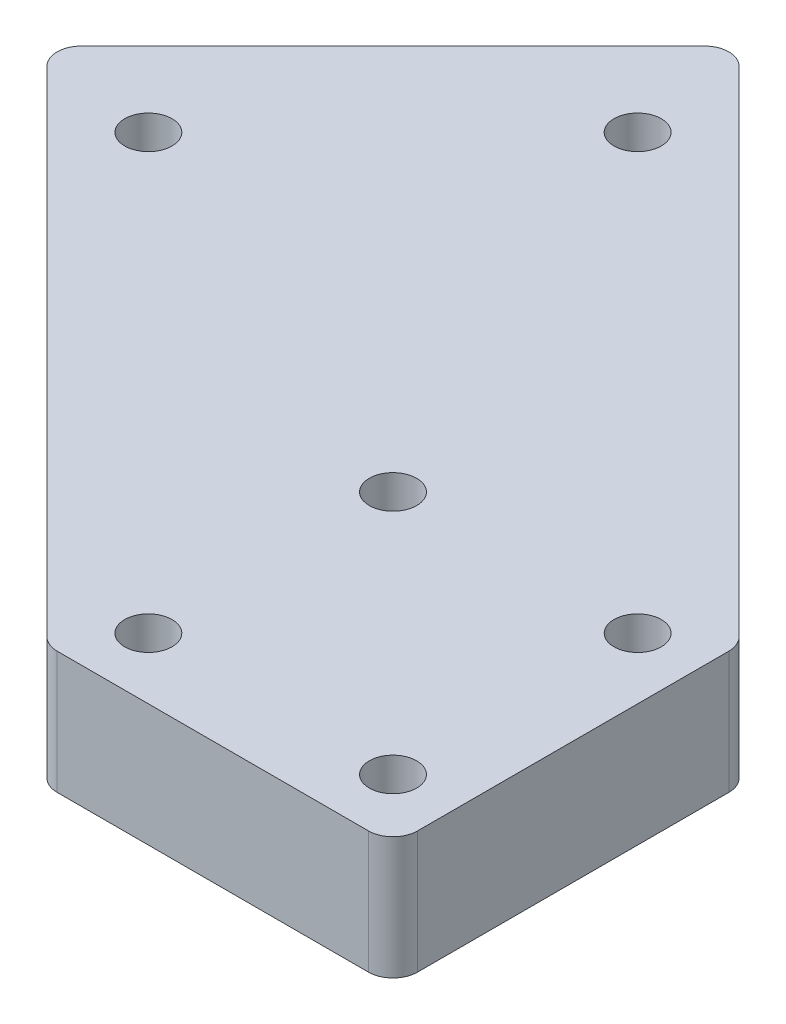
ISO-10303-21;
HEADER;
FILE_DESCRIPTION(('STEP AP214'),'2;1');
FILE_NAME('part.step','',(''),(''),'','','');
FILE_SCHEMA(('AUTOMOTIVE_DESIGN { 1 0 10303 214 1 1 1 1 }'));
ENDSEC;
DATA;
#1=APPLICATION_CONTEXT('core data for automotive mechanical design processes');
#2=APPLICATION_PROTOCOL_DEFINITION('international standard','automotive_design',2000,#1);
#3=PRODUCT_CONTEXT('',#1,'mechanical');
#4=PRODUCT('Part','Part','',(#3));
#5=PRODUCT_RELATED_PRODUCT_CATEGORY('part','',(#4));
#6=PRODUCT_DEFINITION_FORMATION('','',#4);
#7=PRODUCT_DEFINITION_CONTEXT('part definition',#1,'design');
#8=PRODUCT_DEFINITION('design','',#6,#7);
#9=PRODUCT_DEFINITION_SHAPE('','',#8);
#10=(LENGTH_UNIT() NAMED_UNIT(*) SI_UNIT(.MILLI.,.METRE.));
#11=(NAMED_UNIT(*) PLANE_ANGLE_UNIT() SI_UNIT($,.RADIAN.));
#12=(NAMED_UNIT(*) SI_UNIT($,.STERADIAN.) SOLID_ANGLE_UNIT());
#13=UNCERTAINTY_MEASURE_WITH_UNIT(LENGTH_MEASURE(1.E-05),#10,'distance_accuracy_value','');
#14=(GEOMETRIC_REPRESENTATION_CONTEXT(3) GLOBAL_UNCERTAINTY_ASSIGNED_CONTEXT((#13)) GLOBAL_UNIT_ASSIGNED_CONTEXT((#10,
#11,#12)) REPRESENTATION_CONTEXT('',''));
#15=CARTESIAN_POINT('',(0.,0.,0.));
#16=DIRECTION('',(0.,0.,1.));
#17=DIRECTION('',(1.,0.,0.));
#18=AXIS2_PLACEMENT_3D('',#15,#16,#17);
#19=CARTESIAN_POINT('',(-15.4598153963806,12.7,-40.8559797067641));
#20=DIRECTION('',(0.,1.,0.));
#21=DIRECTION('',(0.,0.,1.));
#22=AXIS2_PLACEMENT_3D('',#19,#20,#21);
#23=CYLINDRICAL_SURFACE('',#22,2.45744999999999);
#24=CARTESIAN_POINT('',(-15.4598153963806,12.7,-40.8559797067641));
#25=DIRECTION('',(0.,1.,0.));
#26=DIRECTION('',(0.,0.,1.));
#27=AXIS2_PLACEMENT_3D('',#24,#25,#26);
#28=CIRCLE('',#27,2.45744999999999);
#29=CARTESIAN_POINT('',(-15.4598153963806,12.7,-38.3985297067641));
#30=VERTEX_POINT('',#29);
#31=EDGE_CURVE('E223',#30,#30,#28,.T.);
#32=ORIENTED_EDGE('',*,*,#31,.T.);
#33=EDGE_LOOP('',(#32));
#34=FACE_BOUND('',#33,.T.);
#35=CARTESIAN_POINT('',(-15.4598153963806,6.35,-40.8559797067641));
#36=DIRECTION('',(0.,-1.,0.));
#37=DIRECTION('',(0.,0.,-1.));
#38=AXIS2_PLACEMENT_3D('',#35,#36,#37);
#39=CIRCLE('',#38,2.45744999999999);
#40=CARTESIAN_POINT('',(-15.4598153963806,6.35,-43.3134297067641));
#41=VERTEX_POINT('',#40);
#42=EDGE_CURVE('E155',#41,#41,#39,.F.);
#43=ORIENTED_EDGE('',*,*,#42,.F.);
#44=EDGE_LOOP('',(#43));
#45=FACE_BOUND('',#44,.T.);
#46=ADVANCED_FACE('F43',(#34,#45),#23,.F.);
#47=CARTESIAN_POINT('',(-40.8559797067641,12.7,-15.4598153963805));
#48=DIRECTION('',(0.,1.,0.));
#49=DIRECTION('',(0.,0.,1.));
#50=AXIS2_PLACEMENT_3D('',#47,#48,#49);
#51=CYLINDRICAL_SURFACE('',#50,2.45744999999999);
#52=CARTESIAN_POINT('',(-40.8559797067641,12.7,-15.4598153963805));
#53=DIRECTION('',(0.,1.,0.));
#54=DIRECTION('',(0.,0.,1.));
#55=AXIS2_PLACEMENT_3D('',#52,#53,#54);
#56=CIRCLE('',#55,2.45744999999999);
#57=CARTESIAN_POINT('',(-40.8559797067641,12.7,-13.0023653963806));
#58=VERTEX_POINT('',#57);
#59=EDGE_CURVE('E206',#58,#58,#56,.T.);
#60=ORIENTED_EDGE('',*,*,#59,.T.);
#61=EDGE_LOOP('',(#60));
#62=FACE_BOUND('',#61,.T.);
#63=CARTESIAN_POINT('',(-40.8559797067641,6.35,-15.4598153963805));
#64=DIRECTION('',(0.,-1.,0.));
#65=DIRECTION('',(0.,0.,-1.));
#66=AXIS2_PLACEMENT_3D('',#63,#64,#65);
#67=CIRCLE('',#66,2.45744999999999);
#68=CARTESIAN_POINT('',(-40.8559797067641,6.35,-17.9172653963805));
#69=VERTEX_POINT('',#68);
#70=EDGE_CURVE('E200',#69,#69,#67,.F.);
#71=ORIENTED_EDGE('',*,*,#70,.F.);
#72=EDGE_LOOP('',(#71));
#73=FACE_BOUND('',#72,.T.);
#74=ADVANCED_FACE('F291',(#62,#73),#51,.F.);
#75=CARTESIAN_POINT('',(0.,0.,0.));
#76=DIRECTION('',(0.,1.,0.));
#77=DIRECTION('',(0.,0.,1.));
#78=AXIS2_PLACEMENT_3D('',#75,#76,#77);
#79=PLANE('',#78);
#80=CARTESIAN_POINT('',(-40.8559797067641,0.,-15.4598153963805));
#81=DIRECTION('',(0.,-1.,0.));
#82=DIRECTION('',(0.,0.,-1.));
#83=AXIS2_PLACEMENT_3D('',#80,#81,#82);
#84=CIRCLE('',#83,3.937);
#85=CARTESIAN_POINT('',(-40.8559797067641,0.,-19.3968153963805));
#86=VERTEX_POINT('',#85);
#87=EDGE_CURVE('E208',#86,#86,#84,.T.);
#88=ORIENTED_EDGE('',*,*,#87,.F.);
#89=EDGE_LOOP('',(#88));
#90=FACE_BOUND('',#89,.T.);
#91=CARTESIAN_POINT('',(-15.4598153963806,0.,-40.8559797067641));
#92=DIRECTION('',(0.,-1.,0.));
#93=DIRECTION('',(0.,0.,-1.));
#94=AXIS2_PLACEMENT_3D('',#91,#92,#93);
#95=CIRCLE('',#94,3.937);
#96=CARTESIAN_POINT('',(-15.4598153963806,0.,-44.7929797067641));
#97=VERTEX_POINT('',#96);
#98=EDGE_CURVE('E213',#97,#97,#95,.T.);
#99=ORIENTED_EDGE('',*,*,#98,.F.);
#100=EDGE_LOOP('',(#99));
#101=FACE_BOUND('',#100,.T.);
#102=CARTESIAN_POINT('',(29.5710244842766,0.,29.5710244842766));
#103=DIRECTION('',(0.,-1.,0.));
#104=DIRECTION('',(0.,0.,-1.));
#105=AXIS2_PLACEMENT_3D('',#102,#103,#104);
#106=CIRCLE('',#105,2.45745);
#107=CARTESIAN_POINT('',(29.5710244842766,0.,27.1135744842766));
#108=VERTEX_POINT('',#107);
#109=EDGE_CURVE('E226',#108,#108,#106,.T.);
#110=ORIENTED_EDGE('',*,*,#109,.F.);
#111=EDGE_LOOP('',(#110));
#112=FACE_BOUND('',#111,.T.);
#113=CARTESIAN_POINT('',(29.5710244842766,0.,4.17102448427661));
#114=DIRECTION('',(0.,-1.,0.));
#115=DIRECTION('',(0.,0.,-1.));
#116=AXIS2_PLACEMENT_3D('',#113,#114,#115);
#117=CIRCLE('',#116,2.45745);
#118=CARTESIAN_POINT('',(29.5710244842766,0.,1.71357448427661));
#119=VERTEX_POINT('',#118);
#120=EDGE_CURVE('E238',#119,#119,#117,.T.);
#121=ORIENTED_EDGE('',*,*,#120,.F.);
#122=EDGE_LOOP('',(#121));
#123=FACE_BOUND('',#122,.T.);
#124=CARTESIAN_POINT('',(4.17102448427662,0.,29.5710244842766));
#125=DIRECTION('',(0.,-1.,0.));
#126=DIRECTION('',(0.,0.,-1.));
#127=AXIS2_PLACEMENT_3D('',#124,#125,#126);
#128=CIRCLE('',#127,2.45745);
#129=CARTESIAN_POINT('',(4.17102448427662,0.,27.1135744842766));
#130=VERTEX_POINT('',#129);
#131=EDGE_CURVE('E244',#130,#130,#128,.T.);
#132=ORIENTED_EDGE('',*,*,#131,.F.);
#133=EDGE_LOOP('',(#132));
#134=FACE_BOUND('',#133,.T.);
#135=DIRECTION('',(0.707106781186547,0.,-0.707106781186548));
#136=VECTOR('',#135,1.);
#137=CARTESIAN_POINT('',(-53.8815367264149,0.,-17.9605122421383));
#138=LINE('',#137,#136);
#139=CARTESIAN_POINT('',(-52.0854855022011,0.,-19.7565634663521));
#140=VERTEX_POINT('',#139);
#141=CARTESIAN_POINT('',(-19.7565634663521,0.,-52.0854855022011));
#142=VERTEX_POINT('',#141);
#143=EDGE_CURVE('E125',#140,#142,#138,.T.);
#144=ORIENTED_EDGE('',*,*,#143,.T.);
#145=CARTESIAN_POINT('',(-17.9605122421383,0.,-50.2894342779873));
#146=DIRECTION('',(0.,1.,0.));
#147=DIRECTION('',(0.,0.,1.));
#148=AXIS2_PLACEMENT_3D('',#145,#146,#147);
#149=CIRCLE('',#148,2.54);
#150=CARTESIAN_POINT('',(-16.1644610179245,0.,-52.0854855022011));
#151=VERTEX_POINT('',#150);
#152=EDGE_CURVE('E132',#142,#151,#149,.F.);
#153=ORIENTED_EDGE('',*,*,#152,.T.);
#154=DIRECTION('',(0.707106781186548,0.,0.707106781186547));
#155=VECTOR('',#154,1.);
#156=CARTESIAN_POINT('',(17.9605122421383,0.,-17.9605122421383));
#157=LINE('',#156,#155);
#158=CARTESIAN_POINT('',(35.1770757084904,0.,-0.743948775786169));
#159=VERTEX_POINT('',#158);
#160=EDGE_CURVE('E254',#151,#159,#157,.T.);
#161=ORIENTED_EDGE('',*,*,#160,.T.);
#162=CARTESIAN_POINT('',(33.3810244842766,0.,1.05210244842767));
#163=DIRECTION('',(0.,1.,0.));
#164=DIRECTION('',(0.,0.,1.));
#165=AXIS2_PLACEMENT_3D('',#162,#163,#164);
#166=CIRCLE('',#165,2.54);
#167=CARTESIAN_POINT('',(35.9210244842766,0.,1.05210244842767));
#168=VERTEX_POINT('',#167);
#169=EDGE_CURVE('E133',#159,#168,#166,.F.);
#170=ORIENTED_EDGE('',*,*,#169,.T.);
#171=DIRECTION('',(0.,0.,-1.));
#172=VECTOR('',#171,1.);
#173=CARTESIAN_POINT('',(35.9210244842766,0.,0.));
#174=LINE('',#173,#172);
#175=CARTESIAN_POINT('',(35.9210244842766,0.,33.3810244842766));
#176=VERTEX_POINT('',#175);
#177=EDGE_CURVE('E195',#176,#168,#174,.T.);
#178=ORIENTED_EDGE('',*,*,#177,.F.);
#179=CARTESIAN_POINT('',(33.3810244842766,0.,33.3810244842766));
#180=DIRECTION('',(0.,1.,0.));
#181=DIRECTION('',(0.,0.,1.));
#182=AXIS2_PLACEMENT_3D('',#179,#180,#181);
#183=CIRCLE('',#182,2.54);
#184=CARTESIAN_POINT('',(33.3810244842766,0.,35.9210244842766));
#185=VERTEX_POINT('',#184);
#186=EDGE_CURVE('E159',#176,#185,#183,.F.);
#187=ORIENTED_EDGE('',*,*,#186,.T.);
#188=DIRECTION('',(1.,0.,0.));
#189=VECTOR('',#188,1.);
#190=CARTESIAN_POINT('',(0.,0.,35.9210244842766));
#191=LINE('',#190,#189);
#192=CARTESIAN_POINT('',(1.05210244842767,0.,35.9210244842766));
#193=VERTEX_POINT('',#192);
#194=EDGE_CURVE('E190',#193,#185,#191,.T.);
#195=ORIENTED_EDGE('',*,*,#194,.F.);
#196=CARTESIAN_POINT('',(1.05210244842767,0.,33.3810244842766));
#197=DIRECTION('',(0.,1.,0.));
#198=DIRECTION('',(0.,0.,1.));
#199=AXIS2_PLACEMENT_3D('',#196,#197,#198);
#200=CIRCLE('',#199,2.54);
#201=CARTESIAN_POINT('',(-0.743948775786166,0.,35.1770757084904));
#202=VERTEX_POINT('',#201);
#203=EDGE_CURVE('E150',#193,#202,#200,.F.);
#204=ORIENTED_EDGE('',*,*,#203,.T.);
#205=DIRECTION('',(0.707106781186548,0.,0.707106781186547));
#206=VECTOR('',#205,1.);
#207=CARTESIAN_POINT('',(-17.9605122421383,0.,17.9605122421383));
#208=LINE('',#207,#206);
#209=CARTESIAN_POINT('',(-52.0854855022011,0.,-16.1644610179245));
#210=VERTEX_POINT('',#209);
#211=EDGE_CURVE('E127',#210,#202,#208,.T.);
#212=ORIENTED_EDGE('',*,*,#211,.F.);
#213=CARTESIAN_POINT('',(-50.2894342779873,0.,-17.9605122421383));
#214=DIRECTION('',(0.,1.,0.));
#215=DIRECTION('',(0.,0.,1.));
#216=AXIS2_PLACEMENT_3D('',#213,#214,#215);
#217=CIRCLE('',#216,2.54);
#218=EDGE_CURVE('E121',#210,#140,#217,.F.);
#219=ORIENTED_EDGE('',*,*,#218,.T.);
#220=EDGE_LOOP('',(#144,#153,#161,#170,#178,#187,#195,#204,#212,#219));
#221=FACE_BOUND('',#220,.T.);
#222=CARTESIAN_POINT('',(4.17102448427662,0.,4.17102448427661));
#223=DIRECTION('',(0.,-1.,0.));
#224=DIRECTION('',(0.,0.,-1.));
#225=AXIS2_PLACEMENT_3D('',#222,#223,#224);
#226=CIRCLE('',#225,2.45745);
#227=CARTESIAN_POINT('',(4.17102448427662,0.,1.71357448427662));
#228=VERTEX_POINT('',#227);
#229=EDGE_CURVE('E232',#228,#228,#226,.T.);
#230=ORIENTED_EDGE('',*,*,#229,.F.);
#231=EDGE_LOOP('',(#230));
#232=FACE_BOUND('',#231,.T.);
#233=ADVANCED_FACE('F123',(#90,#101,#112,#123,#134,#221,#232),#79,.F.);
#234=CARTESIAN_POINT('',(0.,12.7,35.9210244842766));
#235=DIRECTION('',(0.,0.,-1.));
#236=DIRECTION('',(-1.,0.,0.));
#237=AXIS2_PLACEMENT_3D('',#234,#235,#236);
#238=PLANE('',#237);
#239=ORIENTED_EDGE('',*,*,#194,.T.);
#240=DIRECTION('',(0.,-1.,0.));
#241=VECTOR('',#240,1.);
#242=CARTESIAN_POINT('',(33.3810244842766,12.7,35.9210244842766));
#243=LINE('',#242,#241);
#244=CARTESIAN_POINT('',(33.3810244842766,12.7,35.9210244842766));
#245=VERTEX_POINT('',#244);
#246=EDGE_CURVE('E11',#185,#245,#243,.F.);
#247=ORIENTED_EDGE('',*,*,#246,.T.);
#248=DIRECTION('',(1.,0.,0.));
#249=VECTOR('',#248,1.);
#250=CARTESIAN_POINT('',(0.,12.7,35.9210244842766));
#251=LINE('',#250,#249);
#252=CARTESIAN_POINT('',(1.05210244842767,12.7,35.9210244842766));
#253=VERTEX_POINT('',#252);
#254=EDGE_CURVE('E152',#253,#245,#251,.T.);
#255=ORIENTED_EDGE('',*,*,#254,.F.);
#256=DIRECTION('',(0.,-1.,0.));
#257=VECTOR('',#256,1.);
#258=CARTESIAN_POINT('',(1.05210244842767,0.,35.9210244842766));
#259=LINE('',#258,#257);
#260=EDGE_CURVE('E51',#253,#193,#259,.T.);
#261=ORIENTED_EDGE('',*,*,#260,.T.);
#262=EDGE_LOOP('',(#239,#247,#255,#261));
#263=FACE_BOUND('',#262,.T.);
#264=ADVANCED_FACE('F189',(#263),#238,.F.);
#265=CARTESIAN_POINT('',(35.9210244842766,12.7,0.));
#266=DIRECTION('',(-1.,0.,0.));
#267=DIRECTION('',(0.,0.,1.));
#268=AXIS2_PLACEMENT_3D('',#265,#266,#267);
#269=PLANE('',#268);
#270=ORIENTED_EDGE('',*,*,#177,.T.);
#271=DIRECTION('',(0.,-1.,0.));
#272=VECTOR('',#271,1.);
#273=CARTESIAN_POINT('',(35.9210244842766,12.7,1.05210244842767));
#274=LINE('',#273,#272);
#275=CARTESIAN_POINT('',(35.9210244842766,12.7,1.05210244842767));
#276=VERTEX_POINT('',#275);
#277=EDGE_CURVE('E58',#168,#276,#274,.F.);
#278=ORIENTED_EDGE('',*,*,#277,.T.);
#279=DIRECTION('',(0.,0.,-1.));
#280=VECTOR('',#279,1.);
#281=CARTESIAN_POINT('',(35.9210244842766,12.7,0.));
#282=LINE('',#281,#280);
#283=CARTESIAN_POINT('',(35.9210244842766,12.7,33.3810244842766));
#284=VERTEX_POINT('',#283);
#285=EDGE_CURVE('E148',#284,#276,#282,.T.);
#286=ORIENTED_EDGE('',*,*,#285,.F.);
#287=DIRECTION('',(0.,-1.,0.));
#288=VECTOR('',#287,1.);
#289=CARTESIAN_POINT('',(35.9210244842766,12.7,33.3810244842766));
#290=LINE('',#289,#288);
#291=EDGE_CURVE('E180',#284,#176,#290,.T.);
#292=ORIENTED_EDGE('',*,*,#291,.T.);
#293=EDGE_LOOP('',(#270,#278,#286,#292));
#294=FACE_BOUND('',#293,.T.);
#295=ADVANCED_FACE('F264',(#294),#269,.F.);
#296=CARTESIAN_POINT('',(0.,12.7,0.));
#297=DIRECTION('',(0.,1.,0.));
#298=DIRECTION('',(0.,0.,1.));
#299=AXIS2_PLACEMENT_3D('',#296,#297,#298);
#300=PLANE('',#299);
#301=ORIENTED_EDGE('',*,*,#59,.F.);
#302=EDGE_LOOP('',(#301));
#303=FACE_BOUND('',#302,.T.);
#304=ORIENTED_EDGE('',*,*,#31,.F.);
#305=EDGE_LOOP('',(#304));
#306=FACE_BOUND('',#305,.T.);
#307=CARTESIAN_POINT('',(29.5710244842766,12.7,29.5710244842766));
#308=DIRECTION('',(0.,-1.,0.));
#309=DIRECTION('',(0.,0.,-1.));
#310=AXIS2_PLACEMENT_3D('',#307,#308,#309);
#311=CIRCLE('',#310,2.45745);
#312=CARTESIAN_POINT('',(29.5710244842766,12.7,27.1135744842766));
#313=VERTEX_POINT('',#312);
#314=EDGE_CURVE('E229',#313,#313,#311,.T.);
#315=ORIENTED_EDGE('',*,*,#314,.T.);
#316=EDGE_LOOP('',(#315));
#317=FACE_BOUND('',#316,.T.);
#318=CARTESIAN_POINT('',(4.17102448427662,12.7,4.17102448427661));
#319=DIRECTION('',(0.,-1.,0.));
#320=DIRECTION('',(0.,0.,-1.));
#321=AXIS2_PLACEMENT_3D('',#318,#319,#320);
#322=CIRCLE('',#321,2.45745);
#323=CARTESIAN_POINT('',(4.17102448427662,12.7,1.71357448427662));
#324=VERTEX_POINT('',#323);
#325=EDGE_CURVE('E235',#324,#324,#322,.T.);
#326=ORIENTED_EDGE('',*,*,#325,.T.);
#327=EDGE_LOOP('',(#326));
#328=FACE_BOUND('',#327,.T.);
#329=CARTESIAN_POINT('',(29.5710244842766,12.7,4.17102448427661));
#330=DIRECTION('',(0.,-1.,0.));
#331=DIRECTION('',(0.,0.,-1.));
#332=AXIS2_PLACEMENT_3D('',#329,#330,#331);
#333=CIRCLE('',#332,2.45745);
#334=CARTESIAN_POINT('',(29.5710244842766,12.7,1.71357448427661));
#335=VERTEX_POINT('',#334);
#336=EDGE_CURVE('E241',#335,#335,#333,.T.);
#337=ORIENTED_EDGE('',*,*,#336,.T.);
#338=EDGE_LOOP('',(#337));
#339=FACE_BOUND('',#338,.T.);
#340=CARTESIAN_POINT('',(4.17102448427662,12.7,29.5710244842766));
#341=DIRECTION('',(0.,-1.,0.));
#342=DIRECTION('',(0.,0.,-1.));
#343=AXIS2_PLACEMENT_3D('',#340,#341,#342);
#344=CIRCLE('',#343,2.45745);
#345=CARTESIAN_POINT('',(4.17102448427662,12.7,27.1135744842766));
#346=VERTEX_POINT('',#345);
#347=EDGE_CURVE('E247',#346,#346,#344,.T.);
#348=ORIENTED_EDGE('',*,*,#347,.T.);
#349=EDGE_LOOP('',(#348));
#350=FACE_BOUND('',#349,.T.);
#351=DIRECTION('',(-0.707106781186548,0.,-0.707106781186547));
#352=VECTOR('',#351,1.);
#353=CARTESIAN_POINT('',(0.,12.7,-35.9210244842766));
#354=LINE('',#353,#352);
#355=CARTESIAN_POINT('',(35.1770757084904,12.7,-0.743948775786173));
#356=VERTEX_POINT('',#355);
#357=CARTESIAN_POINT('',(-16.1644610179245,12.7,-52.0854855022011));
#358=VERTEX_POINT('',#357);
#359=EDGE_CURVE('E250',#356,#358,#354,.T.);
#360=ORIENTED_EDGE('',*,*,#359,.T.);
#361=CARTESIAN_POINT('',(-17.9605122421383,12.7,-50.2894342779873));
#362=DIRECTION('',(0.,1.,0.));
#363=DIRECTION('',(0.,0.,1.));
#364=AXIS2_PLACEMENT_3D('',#361,#362,#363);
#365=CIRCLE('',#364,2.54);
#366=CARTESIAN_POINT('',(-19.7565634663521,12.7,-52.0854855022011));
#367=VERTEX_POINT('',#366);
#368=EDGE_CURVE('E174',#358,#367,#365,.T.);
#369=ORIENTED_EDGE('',*,*,#368,.T.);
#370=DIRECTION('',(0.707106781186547,0.,-0.707106781186548));
#371=VECTOR('',#370,1.);
#372=CARTESIAN_POINT('',(-53.8815367264149,12.7,-17.9605122421383));
#373=LINE('',#372,#371);
#374=CARTESIAN_POINT('',(-52.0854855022011,12.7,-19.7565634663521));
#375=VERTEX_POINT('',#374);
#376=EDGE_CURVE('E143',#375,#367,#373,.T.);
#377=ORIENTED_EDGE('',*,*,#376,.F.);
#378=CARTESIAN_POINT('',(-50.2894342779873,12.7,-17.9605122421383));
#379=DIRECTION('',(0.,1.,0.));
#380=DIRECTION('',(0.,0.,1.));
#381=AXIS2_PLACEMENT_3D('',#378,#379,#380);
#382=CIRCLE('',#381,2.54);
#383=CARTESIAN_POINT('',(-52.0854855022011,12.7,-16.1644610179245));
#384=VERTEX_POINT('',#383);
#385=EDGE_CURVE('E147',#375,#384,#382,.T.);
#386=ORIENTED_EDGE('',*,*,#385,.T.);
#387=DIRECTION('',(-0.707106781186548,0.,-0.707106781186548));
#388=VECTOR('',#387,1.);
#389=CARTESIAN_POINT('',(0.,12.7,35.9210244842766));
#390=LINE('',#389,#388);
#391=CARTESIAN_POINT('',(-0.743948775786166,12.7,35.1770757084904));
#392=VERTEX_POINT('',#391);
#393=EDGE_CURVE('E251',#392,#384,#390,.T.);
#394=ORIENTED_EDGE('',*,*,#393,.F.);
#395=CARTESIAN_POINT('',(1.05210244842767,12.7,33.3810244842766));
#396=DIRECTION('',(0.,1.,0.));
#397=DIRECTION('',(0.,0.,1.));
#398=AXIS2_PLACEMENT_3D('',#395,#396,#397);
#399=CIRCLE('',#398,2.54);
#400=EDGE_CURVE('E168',#392,#253,#399,.T.);
#401=ORIENTED_EDGE('',*,*,#400,.T.);
#402=ORIENTED_EDGE('',*,*,#254,.T.);
#403=CARTESIAN_POINT('',(33.3810244842766,12.7,33.3810244842766));
#404=DIRECTION('',(0.,1.,0.));
#405=DIRECTION('',(0.,0.,1.));
#406=AXIS2_PLACEMENT_3D('',#403,#404,#405);
#407=CIRCLE('',#406,2.54);
#408=EDGE_CURVE('E65',#245,#284,#407,.T.);
#409=ORIENTED_EDGE('',*,*,#408,.T.);
#410=ORIENTED_EDGE('',*,*,#285,.T.);
#411=CARTESIAN_POINT('',(33.3810244842766,12.7,1.05210244842767));
#412=DIRECTION('',(0.,1.,0.));
#413=DIRECTION('',(0.,0.,1.));
#414=AXIS2_PLACEMENT_3D('',#411,#412,#413);
#415=CIRCLE('',#414,2.54);
#416=EDGE_CURVE('E171',#276,#356,#415,.T.);
#417=ORIENTED_EDGE('',*,*,#416,.T.);
#418=EDGE_LOOP('',(#360,#369,#377,#386,#394,#401,#402,#409,#410,#417));
#419=FACE_BOUND('',#418,.T.);
#420=ADVANCED_FACE('F259',(#303,#306,#317,#328,#339,#350,#419),#300,.T.);
#421=CARTESIAN_POINT('',(-53.8815367264149,12.7,-17.9605122421383));
#422=DIRECTION('',(0.707106781186548,0.,0.707106781186547));
#423=DIRECTION('',(0.707106781186547,0.,-0.707106781186548));
#424=AXIS2_PLACEMENT_3D('',#421,#422,#423);
#425=PLANE('',#424);
#426=ORIENTED_EDGE('',*,*,#376,.T.);
#427=DIRECTION('',(0.,-1.,0.));
#428=VECTOR('',#427,1.);
#429=CARTESIAN_POINT('',(-19.7565634663521,12.7,-52.0854855022011));
#430=LINE('',#429,#428);
#431=EDGE_CURVE('E142',#367,#142,#430,.T.);
#432=ORIENTED_EDGE('',*,*,#431,.T.);
#433=ORIENTED_EDGE('',*,*,#143,.F.);
#434=DIRECTION('',(0.,-1.,0.));
#435=VECTOR('',#434,1.);
#436=CARTESIAN_POINT('',(-52.0854855022011,12.7,-19.7565634663521));
#437=LINE('',#436,#435);
#438=EDGE_CURVE('E139',#140,#375,#437,.F.);
#439=ORIENTED_EDGE('',*,*,#438,.T.);
#440=EDGE_LOOP('',(#426,#432,#433,#439));
#441=FACE_BOUND('',#440,.T.);
#442=ADVANCED_FACE('F138',(#441),#425,.F.);
#443=CARTESIAN_POINT('',(-17.9605122421383,0.,17.9605122421383));
#444=DIRECTION('',(-0.707106781186548,0.,0.707106781186548));
#445=DIRECTION('',(0.707106781186548,0.,0.707106781186548));
#446=AXIS2_PLACEMENT_3D('',#443,#444,#445);
#447=PLANE('',#446);
#448=ORIENTED_EDGE('',*,*,#393,.T.);
#449=DIRECTION('',(0.,-1.,0.));
#450=VECTOR('',#449,1.);
#451=CARTESIAN_POINT('',(-52.0854855022011,0.,-16.1644610179245));
#452=LINE('',#451,#450);
#453=EDGE_CURVE('E178',#384,#210,#452,.T.);
#454=ORIENTED_EDGE('',*,*,#453,.T.);
#455=ORIENTED_EDGE('',*,*,#211,.T.);
#456=DIRECTION('',(0.,-1.,0.));
#457=VECTOR('',#456,1.);
#458=CARTESIAN_POINT('',(-0.743948775786166,12.7,35.1770757084904));
#459=LINE('',#458,#457);
#460=EDGE_CURVE('E176',#202,#392,#459,.F.);
#461=ORIENTED_EDGE('',*,*,#460,.T.);
#462=EDGE_LOOP('',(#448,#454,#455,#461));
#463=FACE_BOUND('',#462,.T.);
#464=ADVANCED_FACE('F319',(#463),#447,.T.);
#465=CARTESIAN_POINT('',(17.9605122421383,0.,-17.9605122421383));
#466=DIRECTION('',(-0.707106781186548,0.,0.707106781186548));
#467=DIRECTION('',(0.707106781186548,0.,0.707106781186548));
#468=AXIS2_PLACEMENT_3D('',#465,#466,#467);
#469=PLANE('',#468);
#470=ORIENTED_EDGE('',*,*,#160,.F.);
#471=DIRECTION('',(0.,-1.,0.));
#472=VECTOR('',#471,1.);
#473=CARTESIAN_POINT('',(-16.1644610179245,0.,-52.0854855022011));
#474=LINE('',#473,#472);
#475=EDGE_CURVE('E166',#151,#358,#474,.F.);
#476=ORIENTED_EDGE('',*,*,#475,.T.);
#477=ORIENTED_EDGE('',*,*,#359,.F.);
#478=DIRECTION('',(0.,-1.,0.));
#479=VECTOR('',#478,1.);
#480=CARTESIAN_POINT('',(35.1770757084904,0.,-0.743948775786166));
#481=LINE('',#480,#479);
#482=EDGE_CURVE('E163',#356,#159,#481,.T.);
#483=ORIENTED_EDGE('',*,*,#482,.T.);
#484=EDGE_LOOP('',(#470,#476,#477,#483));
#485=FACE_BOUND('',#484,.T.);
#486=ADVANCED_FACE('F272',(#485),#469,.F.);
#487=CARTESIAN_POINT('',(4.17102448427662,0.,29.5710244842766));
#488=DIRECTION('',(0.,-1.,0.));
#489=DIRECTION('',(0.,0.,-1.));
#490=AXIS2_PLACEMENT_3D('',#487,#488,#489);
#491=CYLINDRICAL_SURFACE('',#490,2.45745);
#492=ORIENTED_EDGE('',*,*,#347,.F.);
#493=EDGE_LOOP('',(#492));
#494=FACE_BOUND('',#493,.T.);
#495=ORIENTED_EDGE('',*,*,#131,.T.);
#496=EDGE_LOOP('',(#495));
#497=FACE_BOUND('',#496,.T.);
#498=ADVANCED_FACE('F314',(#494,#497),#491,.F.);
#499=CARTESIAN_POINT('',(29.5710244842766,0.,4.17102448427661));
#500=DIRECTION('',(0.,-1.,0.));
#501=DIRECTION('',(0.,0.,-1.));
#502=AXIS2_PLACEMENT_3D('',#499,#500,#501);
#503=CYLINDRICAL_SURFACE('',#502,2.45745);
#504=ORIENTED_EDGE('',*,*,#336,.F.);
#505=EDGE_LOOP('',(#504));
#506=FACE_BOUND('',#505,.T.);
#507=ORIENTED_EDGE('',*,*,#120,.T.);
#508=EDGE_LOOP('',(#507));
#509=FACE_BOUND('',#508,.T.);
#510=ADVANCED_FACE('F310',(#506,#509),#503,.F.);
#511=CARTESIAN_POINT('',(4.17102448427662,0.,4.17102448427661));
#512=DIRECTION('',(0.,-1.,0.));
#513=DIRECTION('',(0.,0.,-1.));
#514=AXIS2_PLACEMENT_3D('',#511,#512,#513);
#515=CYLINDRICAL_SURFACE('',#514,2.45745);
#516=ORIENTED_EDGE('',*,*,#325,.F.);
#517=EDGE_LOOP('',(#516));
#518=FACE_BOUND('',#517,.T.);
#519=ORIENTED_EDGE('',*,*,#229,.T.);
#520=EDGE_LOOP('',(#519));
#521=FACE_BOUND('',#520,.T.);
#522=ADVANCED_FACE('F306',(#518,#521),#515,.F.);
#523=CARTESIAN_POINT('',(29.5710244842766,0.,29.5710244842766));
#524=DIRECTION('',(0.,-1.,0.));
#525=DIRECTION('',(0.,0.,-1.));
#526=AXIS2_PLACEMENT_3D('',#523,#524,#525);
#527=CYLINDRICAL_SURFACE('',#526,2.45745);
#528=ORIENTED_EDGE('',*,*,#314,.F.);
#529=EDGE_LOOP('',(#528));
#530=FACE_BOUND('',#529,.T.);
#531=ORIENTED_EDGE('',*,*,#109,.T.);
#532=EDGE_LOOP('',(#531));
#533=FACE_BOUND('',#532,.T.);
#534=ADVANCED_FACE('F303',(#530,#533),#527,.F.);
#535=CARTESIAN_POINT('',(-40.8559797067641,6.35,-15.4598153963805));
#536=DIRECTION('',(0.,-1.,0.));
#537=DIRECTION('',(0.,0.,-1.));
#538=AXIS2_PLACEMENT_3D('',#535,#536,#537);
#539=PLANE('',#538);
#540=CARTESIAN_POINT('',(-40.8559797067641,6.35,-15.4598153963805));
#541=DIRECTION('',(0.,-1.,0.));
#542=DIRECTION('',(0.,0.,-1.));
#543=AXIS2_PLACEMENT_3D('',#540,#541,#542);
#544=CIRCLE('',#543,3.937);
#545=CARTESIAN_POINT('',(-40.8559797067641,6.35,-19.3968153963805));
#546=VERTEX_POINT('',#545);
#547=EDGE_CURVE('E202',#546,#546,#544,.T.);
#548=ORIENTED_EDGE('',*,*,#547,.T.);
#549=EDGE_LOOP('',(#548));
#550=FACE_BOUND('',#549,.T.);
#551=ORIENTED_EDGE('',*,*,#70,.T.);
#552=EDGE_LOOP('',(#551));
#553=FACE_BOUND('',#552,.T.);
#554=ADVANCED_FACE('F305',(#550,#553),#539,.T.);
#555=CARTESIAN_POINT('',(-40.8559797067641,6.35,-15.4598153963805));
#556=DIRECTION('',(0.,-1.,0.));
#557=DIRECTION('',(0.,0.,-1.));
#558=AXIS2_PLACEMENT_3D('',#555,#556,#557);
#559=CYLINDRICAL_SURFACE('',#558,3.937);
#560=ORIENTED_EDGE('',*,*,#547,.F.);
#561=EDGE_LOOP('',(#560));
#562=FACE_BOUND('',#561,.T.);
#563=ORIENTED_EDGE('',*,*,#87,.T.);
#564=EDGE_LOOP('',(#563));
#565=FACE_BOUND('',#564,.T.);
#566=ADVANCED_FACE('F415',(#562,#565),#559,.F.);
#567=CARTESIAN_POINT('',(-15.4598153963806,6.35,-40.8559797067641));
#568=DIRECTION('',(0.,-1.,0.));
#569=DIRECTION('',(0.,0.,-1.));
#570=AXIS2_PLACEMENT_3D('',#567,#568,#569);
#571=PLANE('',#570);
#572=CARTESIAN_POINT('',(-15.4598153963806,6.35,-40.8559797067641));
#573=DIRECTION('',(0.,-1.,0.));
#574=DIRECTION('',(0.,0.,-1.));
#575=AXIS2_PLACEMENT_3D('',#572,#573,#574);
#576=CIRCLE('',#575,3.937);
#577=CARTESIAN_POINT('',(-15.4598153963806,6.35,-44.7929797067641));
#578=VERTEX_POINT('',#577);
#579=EDGE_CURVE('E218',#578,#578,#576,.T.);
#580=ORIENTED_EDGE('',*,*,#579,.T.);
#581=EDGE_LOOP('',(#580));
#582=FACE_BOUND('',#581,.T.);
#583=ORIENTED_EDGE('',*,*,#42,.T.);
#584=EDGE_LOOP('',(#583));
#585=FACE_BOUND('',#584,.T.);
#586=ADVANCED_FACE('F286',(#582,#585),#571,.T.);
#587=CARTESIAN_POINT('',(-15.4598153963806,6.35,-40.8559797067641));
#588=DIRECTION('',(0.,-1.,0.));
#589=DIRECTION('',(0.,0.,-1.));
#590=AXIS2_PLACEMENT_3D('',#587,#588,#589);
#591=CYLINDRICAL_SURFACE('',#590,3.937);
#592=ORIENTED_EDGE('',*,*,#579,.F.);
#593=EDGE_LOOP('',(#592));
#594=FACE_BOUND('',#593,.T.);
#595=ORIENTED_EDGE('',*,*,#98,.T.);
#596=EDGE_LOOP('',(#595));
#597=FACE_BOUND('',#596,.T.);
#598=ADVANCED_FACE('F278',(#594,#597),#591,.F.);
#599=CARTESIAN_POINT('',(-17.9605122421383,12.7,-50.2894342779873));
#600=DIRECTION('',(0.,-1.,0.));
#601=DIRECTION('',(0.,0.,-1.));
#602=AXIS2_PLACEMENT_3D('',#599,#600,#601);
#603=CYLINDRICAL_SURFACE('',#602,2.54);
#604=ORIENTED_EDGE('',*,*,#368,.F.);
#605=ORIENTED_EDGE('',*,*,#475,.F.);
#606=ORIENTED_EDGE('',*,*,#152,.F.);
#607=ORIENTED_EDGE('',*,*,#431,.F.);
#608=EDGE_LOOP('',(#604,#605,#606,#607));
#609=FACE_BOUND('',#608,.T.);
#610=ADVANCED_FACE('F276',(#609),#603,.T.);
#611=CARTESIAN_POINT('',(-50.2894342779873,0.,-17.9605122421383));
#612=DIRECTION('',(0.,1.,0.));
#613=DIRECTION('',(0.,0.,1.));
#614=AXIS2_PLACEMENT_3D('',#611,#612,#613);
#615=CYLINDRICAL_SURFACE('',#614,2.54);
#616=ORIENTED_EDGE('',*,*,#385,.F.);
#617=ORIENTED_EDGE('',*,*,#438,.F.);
#618=ORIENTED_EDGE('',*,*,#218,.F.);
#619=ORIENTED_EDGE('',*,*,#453,.F.);
#620=EDGE_LOOP('',(#616,#617,#618,#619));
#621=FACE_BOUND('',#620,.T.);
#622=ADVANCED_FACE('F146',(#621),#615,.T.);
#623=CARTESIAN_POINT('',(33.3810244842766,0.,1.05210244842767));
#624=DIRECTION('',(0.,-1.,0.));
#625=DIRECTION('',(0.,0.,-1.));
#626=AXIS2_PLACEMENT_3D('',#623,#624,#625);
#627=CYLINDRICAL_SURFACE('',#626,2.54);
#628=ORIENTED_EDGE('',*,*,#416,.F.);
#629=ORIENTED_EDGE('',*,*,#277,.F.);
#630=ORIENTED_EDGE('',*,*,#169,.F.);
#631=ORIENTED_EDGE('',*,*,#482,.F.);
#632=EDGE_LOOP('',(#628,#629,#630,#631));
#633=FACE_BOUND('',#632,.T.);
#634=ADVANCED_FACE('F269',(#633),#627,.T.);
#635=CARTESIAN_POINT('',(33.3810244842766,12.7,33.3810244842766));
#636=DIRECTION('',(0.,-1.,0.));
#637=DIRECTION('',(0.,0.,-1.));
#638=AXIS2_PLACEMENT_3D('',#635,#636,#637);
#639=CYLINDRICAL_SURFACE('',#638,2.54);
#640=ORIENTED_EDGE('',*,*,#408,.F.);
#641=ORIENTED_EDGE('',*,*,#246,.F.);
#642=ORIENTED_EDGE('',*,*,#186,.F.);
#643=ORIENTED_EDGE('',*,*,#291,.F.);
#644=EDGE_LOOP('',(#640,#641,#642,#643));
#645=FACE_BOUND('',#644,.T.);
#646=ADVANCED_FACE('F263',(#645),#639,.T.);
#647=CARTESIAN_POINT('',(1.05210244842767,12.7,33.3810244842766));
#648=DIRECTION('',(0.,1.,0.));
#649=DIRECTION('',(0.,0.,1.));
#650=AXIS2_PLACEMENT_3D('',#647,#648,#649);
#651=CYLINDRICAL_SURFACE('',#650,2.54);
#652=ORIENTED_EDGE('',*,*,#400,.F.);
#653=ORIENTED_EDGE('',*,*,#460,.F.);
#654=ORIENTED_EDGE('',*,*,#203,.F.);
#655=ORIENTED_EDGE('',*,*,#260,.F.);
#656=EDGE_LOOP('',(#652,#653,#654,#655));
#657=FACE_BOUND('',#656,.T.);
#658=ADVANCED_FACE('F45',(#657),#651,.T.);
#659=CLOSED_SHELL('',(#46,#74,#233,#264,#295,#420,#442,#464,#486,#498,#510,#522,#534,#554,#566,
#586,#598,#610,#622,#634,#646,#658));
#660=MANIFOLD_SOLID_BREP('B2',#659);
#661=ADVANCED_BREP_SHAPE_REPRESENTATION('',(#18,#660),#14);
#662=SHAPE_DEFINITION_REPRESENTATION(#9,#661);
ENDSEC;
END-ISO-10303-21;
